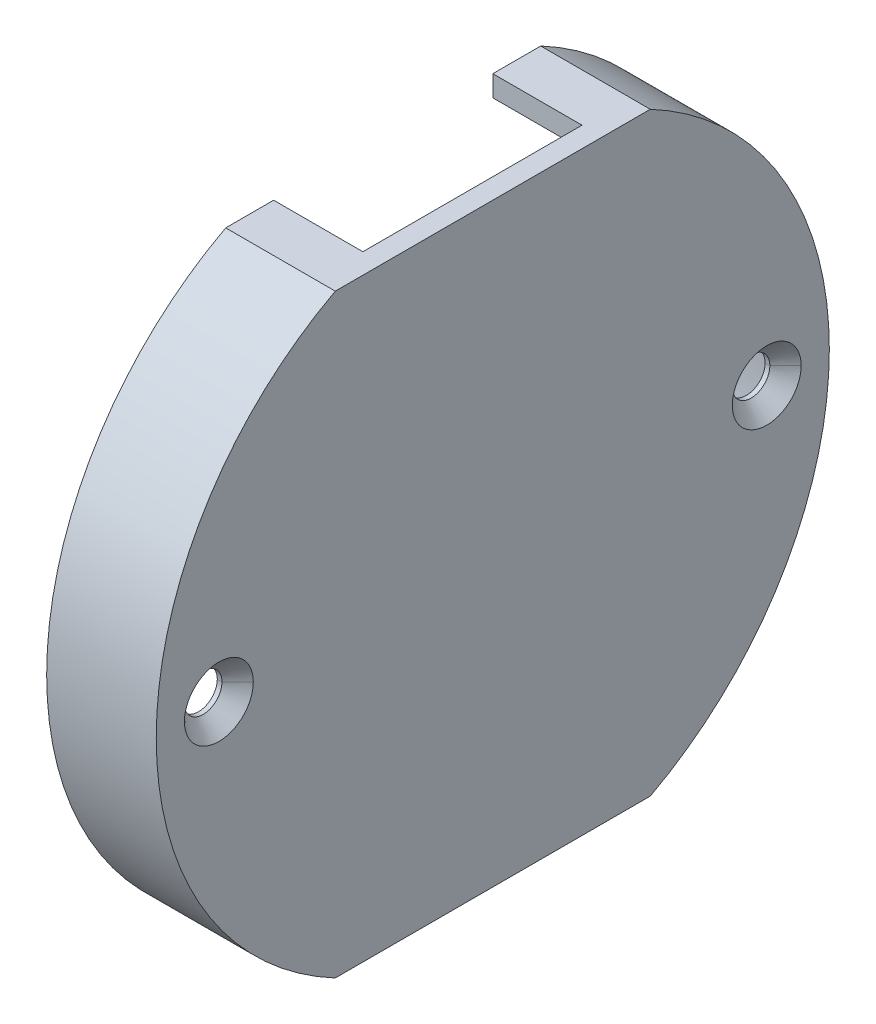
ISO-10303-21;
HEADER;
FILE_DESCRIPTION(('STEP AP214'),'2;1');
FILE_NAME('part.step','',(''),(''),'','','');
FILE_SCHEMA(('AUTOMOTIVE_DESIGN { 1 0 10303 214 1 1 1 1 }'));
ENDSEC;
DATA;
#1=APPLICATION_CONTEXT('core data for automotive mechanical design processes');
#2=APPLICATION_PROTOCOL_DEFINITION('international standard','automotive_design',2000,#1);
#3=PRODUCT_CONTEXT('',#1,'mechanical');
#4=PRODUCT('Part','Part','',(#3));
#5=PRODUCT_RELATED_PRODUCT_CATEGORY('part','',(#4));
#6=PRODUCT_DEFINITION_FORMATION('','',#4);
#7=PRODUCT_DEFINITION_CONTEXT('part definition',#1,'design');
#8=PRODUCT_DEFINITION('design','',#6,#7);
#9=PRODUCT_DEFINITION_SHAPE('','',#8);
#10=(LENGTH_UNIT() NAMED_UNIT(*) SI_UNIT(.MILLI.,.METRE.));
#11=(NAMED_UNIT(*) PLANE_ANGLE_UNIT() SI_UNIT($,.RADIAN.));
#12=(NAMED_UNIT(*) SI_UNIT($,.STERADIAN.) SOLID_ANGLE_UNIT());
#13=UNCERTAINTY_MEASURE_WITH_UNIT(LENGTH_MEASURE(1.E-05),#10,'distance_accuracy_value','');
#14=(GEOMETRIC_REPRESENTATION_CONTEXT(3) GLOBAL_UNCERTAINTY_ASSIGNED_CONTEXT((#13)) GLOBAL_UNIT_ASSIGNED_CONTEXT((#10,
#11,#12)) REPRESENTATION_CONTEXT('',''));
#15=CARTESIAN_POINT('',(0.,0.,0.));
#16=DIRECTION('',(0.,0.,1.));
#17=DIRECTION('',(1.,0.,0.));
#18=AXIS2_PLACEMENT_3D('',#15,#16,#17);
#19=CARTESIAN_POINT('',(-9.826057760967,14.645610965575,4.562544302552));
#20=DIRECTION('',(1.,0.,0.));
#21=DIRECTION('',(0.,-1.2508E-11,-1.));
#22=AXIS2_PLACEMENT_3D('',#19,#20,#21);
#23=CYLINDRICAL_SURFACE('',#22,21.5);
#24=DIRECTION('',(-1.,0.,0.));
#25=VECTOR('',#24,1.);
#26=CARTESIAN_POINT('',(-47.826057760967,-4.35438903455086,-5.49976159595941));
#27=LINE('',#26,#25);
#28=CARTESIAN_POINT('',(-1.826057760967,-4.35438903455086,-5.49976159595941));
#29=VERTEX_POINT('',#28);
#30=CARTESIAN_POINT('',(-8.826057760967,-4.35438903455086,-5.49976159595941));
#31=VERTEX_POINT('',#30);
#32=EDGE_CURVE('E318',#29,#31,#27,.T.);
#33=ORIENTED_EDGE('',*,*,#32,.T.);
#34=CARTESIAN_POINT('',(-8.826057760967,14.645610965575,4.562544302552));
#35=DIRECTION('',(-1.,0.,0.));
#36=DIRECTION('',(0.,0.,1.));
#37=AXIS2_PLACEMENT_3D('',#34,#35,#36);
#38=CIRCLE('',#37,21.5);
#39=CARTESIAN_POINT('',(-8.826057760967,14.6456109653061,-16.937455697448));
#40=VERTEX_POINT('',#39);
#41=EDGE_CURVE('E227',#40,#31,#38,.T.);
#42=ORIENTED_EDGE('',*,*,#41,.F.);
#43=DIRECTION('',(1.,0.,0.));
#44=VECTOR('',#43,1.);
#45=CARTESIAN_POINT('',(-9.826057760967,14.6456109653061,-16.937455697448));
#46=LINE('',#45,#44);
#47=CARTESIAN_POINT('',(-1.826057760967,14.6456109653061,-16.937455697448));
#48=VERTEX_POINT('',#47);
#49=EDGE_CURVE('E305',#40,#48,#46,.T.);
#50=ORIENTED_EDGE('',*,*,#49,.T.);
#51=CARTESIAN_POINT('',(-1.826057760967,14.645610965575,4.562544302552));
#52=DIRECTION('',(-1.,0.,0.));
#53=DIRECTION('',(0.,-1.2508E-11,-1.));
#54=AXIS2_PLACEMENT_3D('',#51,#52,#53);
#55=CIRCLE('',#54,21.5);
#56=EDGE_CURVE('E322',#48,#29,#55,.T.);
#57=ORIENTED_EDGE('',*,*,#56,.T.);
#58=EDGE_LOOP('',(#33,#42,#50,#57));
#59=FACE_BOUND('',#58,.T.);
#60=ADVANCED_FACE('F42',(#59),#23,.T.);
#61=CARTESIAN_POINT('',(-3.126057760967,14.645610965575,4.562544302552));
#62=DIRECTION('',(-1.,0.,0.));
#63=DIRECTION('',(0.,1.2508E-11,1.));
#64=AXIS2_PLACEMENT_3D('',#61,#62,#63);
#65=CYLINDRICAL_SURFACE('',#64,19.);
#66=CARTESIAN_POINT('',(-8.826057760967,14.645610965575,4.562544302552));
#67=DIRECTION('',(-1.,0.,0.));
#68=DIRECTION('',(0.,0.,1.));
#69=AXIS2_PLACEMENT_3D('',#66,#67,#68);
#70=CIRCLE('',#69,19.);
#71=CARTESIAN_POINT('',(-8.826057760967,32.3091326983183,11.5625443023311));
#72=VERTEX_POINT('',#71);
#73=CARTESIAN_POINT('',(-8.826057760967,14.645610965575,23.562544302552));
#74=VERTEX_POINT('',#73);
#75=EDGE_CURVE('E239',#72,#74,#70,.F.);
#76=ORIENTED_EDGE('',*,*,#75,.F.);
#77=DIRECTION('',(-1.,0.,0.));
#78=VECTOR('',#77,1.);
#79=CARTESIAN_POINT('',(-3.126057760967,32.3091326983183,11.5625443023311));
#80=LINE('',#79,#78);
#81=CARTESIAN_POINT('',(-3.126057760967,32.3091326983183,11.5625443023311));
#82=VERTEX_POINT('',#81);
#83=EDGE_CURVE('E279',#82,#72,#80,.T.);
#84=ORIENTED_EDGE('',*,*,#83,.F.);
#85=CARTESIAN_POINT('',(-3.126057760967,14.645610965575,4.562544302552));
#86=DIRECTION('',(-1.,0.,0.));
#87=DIRECTION('',(0.,1.2508E-11,1.));
#88=AXIS2_PLACEMENT_3D('',#85,#86,#87);
#89=CIRCLE('',#88,19.);
#90=CARTESIAN_POINT('',(-3.126057760967,14.6456109658127,23.562544302552));
#91=VERTEX_POINT('',#90);
#92=EDGE_CURVE('E286',#91,#82,#89,.T.);
#93=ORIENTED_EDGE('',*,*,#92,.F.);
#94=DIRECTION('',(-1.,0.,0.));
#95=VECTOR('',#94,1.);
#96=CARTESIAN_POINT('',(-3.126057760967,14.6456109658127,23.562544302552));
#97=LINE('',#96,#95);
#98=EDGE_CURVE('E299',#91,#74,#97,.T.);
#99=ORIENTED_EDGE('',*,*,#98,.T.);
#100=EDGE_LOOP('',(#76,#84,#93,#99));
#101=FACE_BOUND('',#100,.T.);
#102=ADVANCED_FACE('F474',(#101),#65,.F.);
#103=CARTESIAN_POINT('',(-47.826057760967,-4.35438903470274,-17.6427834972376));
#104=DIRECTION('',(0.,1.,-1.2508E-11));
#105=DIRECTION('',(0.,1.2508E-11,1.));
#106=AXIS2_PLACEMENT_3D('',#103,#104,#105);
#107=PLANE('',#106);
#108=DIRECTION('',(0.,1.2508E-11,1.));
#109=VECTOR('',#108,1.);
#110=CARTESIAN_POINT('',(-8.826057760967,-4.35438903470274,-17.6427834972376));
#111=LINE('',#110,#109);
#112=CARTESIAN_POINT('',(-8.826057760967,-4.35438903451255,-2.43745569721035));
#113=VERTEX_POINT('',#112);
#114=EDGE_CURVE('E442',#31,#113,#111,.T.);
#115=ORIENTED_EDGE('',*,*,#114,.F.);
#116=ORIENTED_EDGE('',*,*,#32,.F.);
#117=DIRECTION('',(0.,1.2508E-11,1.));
#118=VECTOR('',#117,1.);
#119=CARTESIAN_POINT('',(-1.826057760967,-4.354389034425,4.56254430278965));
#120=LINE('',#119,#118);
#121=CARTESIAN_POINT('',(-1.826057760967,-4.35438903429914,14.6248502015387));
#122=VERTEX_POINT('',#121);
#123=EDGE_CURVE('E285',#29,#122,#120,.T.);
#124=ORIENTED_EDGE('',*,*,#123,.T.);
#125=DIRECTION('',(1.,0.,0.));
#126=VECTOR('',#125,1.);
#127=CARTESIAN_POINT('',(-47.826057760967,-4.35438903429914,14.6248502015387));
#128=LINE('',#127,#126);
#129=CARTESIAN_POINT('',(-8.826057760967,-4.35438903429915,14.6248502015387));
#130=VERTEX_POINT('',#129);
#131=EDGE_CURVE('E253',#130,#122,#128,.T.);
#132=ORIENTED_EDGE('',*,*,#131,.F.);
#133=CARTESIAN_POINT('',(-8.826057760967,-4.35438903433744,11.5625443027897));
#134=VERTEX_POINT('',#133);
#135=EDGE_CURVE('E222',#134,#130,#111,.T.);
#136=ORIENTED_EDGE('',*,*,#135,.F.);
#137=DIRECTION('',(-1.,0.,0.));
#138=VECTOR('',#137,1.);
#139=CARTESIAN_POINT('',(-47.826057760967,-4.35438903433744,11.5625443027897));
#140=LINE('',#139,#138);
#141=CARTESIAN_POINT('',(-3.126057760967,-4.35438903433744,11.5625443027897));
#142=VERTEX_POINT('',#141);
#143=EDGE_CURVE('E293',#142,#134,#140,.T.);
#144=ORIENTED_EDGE('',*,*,#143,.F.);
#145=DIRECTION('',(0.,1.25079174365893E-11,1.));
#146=VECTOR('',#145,1.);
#147=CARTESIAN_POINT('',(-3.126057760967,-4.35438903470274,-17.6427834972376));
#148=LINE('',#147,#146);
#149=CARTESIAN_POINT('',(-3.126057760967,-4.35438903451255,-2.43745569721035));
#150=VERTEX_POINT('',#149);
#151=EDGE_CURVE('E311',#150,#142,#148,.T.);
#152=ORIENTED_EDGE('',*,*,#151,.F.);
#153=DIRECTION('',(1.,0.,0.));
#154=VECTOR('',#153,1.);
#155=CARTESIAN_POINT('',(-47.826057760967,-4.35438903451255,-2.43745569721035));
#156=LINE('',#155,#154);
#157=EDGE_CURVE('E347',#113,#150,#156,.T.);
#158=ORIENTED_EDGE('',*,*,#157,.F.);
#159=EDGE_LOOP('',(#115,#116,#124,#132,#136,#144,#152,#158));
#160=FACE_BOUND('',#159,.T.);
#161=ADVANCED_FACE('F506',(#160),#107,.F.);
#162=CARTESIAN_POINT('',(-9.826057760967,14.645610965575,4.562544302552));
#163=DIRECTION('',(1.,0.,0.));
#164=DIRECTION('',(0.,-1.2508E-11,-1.));
#165=AXIS2_PLACEMENT_3D('',#162,#163,#164);
#166=CYLINDRICAL_SURFACE('',#165,21.5);
#167=ORIENTED_EDGE('',*,*,#49,.F.);
#168=CARTESIAN_POINT('',(-8.826057760967,33.6456109654491,-5.49976159643472));
#169=VERTEX_POINT('',#168);
#170=EDGE_CURVE('E229',#169,#40,#38,.T.);
#171=ORIENTED_EDGE('',*,*,#170,.F.);
#172=DIRECTION('',(1.,0.,0.));
#173=VECTOR('',#172,1.);
#174=CARTESIAN_POINT('',(-9.826057760967,33.6456109654491,-5.49976159643469));
#175=LINE('',#174,#173);
#176=CARTESIAN_POINT('',(-1.826057760967,33.6456109654491,-5.49976159643469));
#177=VERTEX_POINT('',#176);
#178=EDGE_CURVE('E401',#169,#177,#175,.T.);
#179=ORIENTED_EDGE('',*,*,#178,.T.);
#180=CARTESIAN_POINT('',(-1.826057760967,14.645610965575,4.562544302552));
#181=DIRECTION('',(-1.,0.,0.));
#182=DIRECTION('',(0.,-1.25088881784197E-11,-1.));
#183=AXIS2_PLACEMENT_3D('',#180,#181,#182);
#184=CIRCLE('',#183,21.5);
#185=EDGE_CURVE('E378',#177,#48,#184,.T.);
#186=ORIENTED_EDGE('',*,*,#185,.T.);
#187=EDGE_LOOP('',(#167,#171,#179,#186));
#188=FACE_BOUND('',#187,.T.);
#189=ADVANCED_FACE('F538',(#188),#166,.T.);
#190=CARTESIAN_POINT('',(-47.826057760967,33.6456109657783,20.8193056053976));
#191=DIRECTION('',(0.,-1.,1.2508E-11));
#192=DIRECTION('',(1.,0.,0.));
#193=AXIS2_PLACEMENT_3D('',#190,#191,#192);
#194=PLANE('',#193);
#195=DIRECTION('',(0.,-1.2508E-11,-1.));
#196=VECTOR('',#195,1.);
#197=CARTESIAN_POINT('',(-8.826057760967,33.6456109657783,20.8193056053976));
#198=LINE('',#197,#196);
#199=CARTESIAN_POINT('',(-8.826057760967,33.6456109657009,14.6248502010634));
#200=VERTEX_POINT('',#199);
#201=CARTESIAN_POINT('',(-8.826057760967,33.6456109656626,11.5625443023143));
#202=VERTEX_POINT('',#201);
#203=EDGE_CURVE('E65',#200,#202,#198,.T.);
#204=ORIENTED_EDGE('',*,*,#203,.F.);
#205=DIRECTION('',(-1.,0.,0.));
#206=VECTOR('',#205,1.);
#207=CARTESIAN_POINT('',(-47.826057760967,33.6456109657009,14.6248502010634));
#208=LINE('',#207,#206);
#209=CARTESIAN_POINT('',(-1.826057760967,33.6456109657009,14.6248502010634));
#210=VERTEX_POINT('',#209);
#211=EDGE_CURVE('E235',#210,#200,#208,.T.);
#212=ORIENTED_EDGE('',*,*,#211,.F.);
#213=DIRECTION('',(0.,-1.2508E-11,-1.));
#214=VECTOR('',#213,1.);
#215=CARTESIAN_POINT('',(-1.826057760967,33.645610965575,4.56254430231435));
#216=LINE('',#215,#214);
#217=EDGE_CURVE('E264',#210,#177,#216,.T.);
#218=ORIENTED_EDGE('',*,*,#217,.T.);
#219=ORIENTED_EDGE('',*,*,#178,.F.);
#220=CARTESIAN_POINT('',(-8.826057760967,33.6456109654874,-2.43745569768565));
#221=VERTEX_POINT('',#220);
#222=EDGE_CURVE('E241',#221,#169,#198,.T.);
#223=ORIENTED_EDGE('',*,*,#222,.F.);
#224=DIRECTION('',(-1.,0.,0.));
#225=VECTOR('',#224,1.);
#226=CARTESIAN_POINT('',(-47.826057760967,33.6456109654874,-2.43745569768565));
#227=LINE('',#226,#225);
#228=CARTESIAN_POINT('',(-3.126057760967,33.6456109654874,-2.43745569768565));
#229=VERTEX_POINT('',#228);
#230=EDGE_CURVE('E274',#229,#221,#227,.T.);
#231=ORIENTED_EDGE('',*,*,#230,.F.);
#232=DIRECTION('',(0.,-1.2508E-11,-1.));
#233=VECTOR('',#232,1.);
#234=CARTESIAN_POINT('',(-3.126057760967,33.6456109657783,20.8193056053976));
#235=LINE('',#234,#233);
#236=CARTESIAN_POINT('',(-3.126057760967,33.6456109656626,11.5625443023143));
#237=VERTEX_POINT('',#236);
#238=EDGE_CURVE('E316',#237,#229,#235,.T.);
#239=ORIENTED_EDGE('',*,*,#238,.F.);
#240=DIRECTION('',(1.,0.,0.));
#241=VECTOR('',#240,1.);
#242=CARTESIAN_POINT('',(-47.826057760967,33.6456109656626,11.5625443023143));
#243=LINE('',#242,#241);
#244=EDGE_CURVE('E237',#202,#237,#243,.T.);
#245=ORIENTED_EDGE('',*,*,#244,.F.);
#246=EDGE_LOOP('',(#204,#212,#218,#219,#223,#231,#239,#245));
#247=FACE_BOUND('',#246,.T.);
#248=ADVANCED_FACE('F233',(#247),#194,.F.);
#249=CARTESIAN_POINT('',(-9.826057760967,14.645610965575,4.562544302552));
#250=DIRECTION('',(1.,0.,0.));
#251=DIRECTION('',(0.,-1.2508E-11,-1.));
#252=AXIS2_PLACEMENT_3D('',#249,#250,#251);
#253=CYLINDRICAL_SURFACE('',#252,21.5);
#254=ORIENTED_EDGE('',*,*,#211,.T.);
#255=EDGE_CURVE('E219',#130,#200,#38,.T.);
#256=ORIENTED_EDGE('',*,*,#255,.F.);
#257=ORIENTED_EDGE('',*,*,#131,.T.);
#258=CARTESIAN_POINT('',(-1.826057760967,14.645610965575,4.562544302552));
#259=DIRECTION('',(-1.,0.,0.));
#260=DIRECTION('',(0.,-1.2508E-11,-1.));
#261=AXIS2_PLACEMENT_3D('',#258,#259,#260);
#262=CIRCLE('',#261,21.5);
#263=EDGE_CURVE('E244',#122,#210,#262,.T.);
#264=ORIENTED_EDGE('',*,*,#263,.T.);
#265=EDGE_LOOP('',(#254,#256,#257,#264));
#266=FACE_BOUND('',#265,.T.);
#267=ADVANCED_FACE('F242',(#266),#253,.T.);
#268=CARTESIAN_POINT('',(-3.126057760967,14.645610965575,4.562544302552));
#269=DIRECTION('',(-1.,0.,0.));
#270=DIRECTION('',(0.,1.2508E-11,1.));
#271=AXIS2_PLACEMENT_3D('',#268,#269,#270);
#272=CYLINDRICAL_SURFACE('',#271,19.);
#273=CARTESIAN_POINT('',(-8.826057760967,14.645610965575,4.562544302552));
#274=DIRECTION('',(-1.,0.,0.));
#275=DIRECTION('',(0.,0.,1.));
#276=AXIS2_PLACEMENT_3D('',#273,#274,#275);
#277=CIRCLE('',#276,19.);
#278=CARTESIAN_POINT('',(-8.826057760967,-3.01791076716825,-2.43745569722706));
#279=VERTEX_POINT('',#278);
#280=CARTESIAN_POINT('',(-8.826057760967,32.3091326981431,-2.43745569766894));
#281=VERTEX_POINT('',#280);
#282=EDGE_CURVE('E58',#279,#281,#277,.F.);
#283=ORIENTED_EDGE('',*,*,#282,.F.);
#284=DIRECTION('',(-1.,0.,0.));
#285=VECTOR('',#284,1.);
#286=CARTESIAN_POINT('',(-3.126057760967,-3.01791076716825,-2.43745569722706));
#287=LINE('',#286,#285);
#288=CARTESIAN_POINT('',(-3.126057760967,-3.01791076716825,-2.43745569722706));
#289=VERTEX_POINT('',#288);
#290=EDGE_CURVE('E344',#289,#279,#287,.T.);
#291=ORIENTED_EDGE('',*,*,#290,.F.);
#292=CARTESIAN_POINT('',(-3.126057760967,14.645610965575,4.562544302552));
#293=DIRECTION('',(-1.,0.,0.));
#294=DIRECTION('',(0.,1.2508E-11,1.));
#295=AXIS2_PLACEMENT_3D('',#292,#293,#294);
#296=CIRCLE('',#295,19.);
#297=CARTESIAN_POINT('',(-3.126057760967,32.3091326981431,-2.43745569766894));
#298=VERTEX_POINT('',#297);
#299=EDGE_CURVE('E317',#298,#289,#296,.T.);
#300=ORIENTED_EDGE('',*,*,#299,.F.);
#301=DIRECTION('',(1.,0.,0.));
#302=VECTOR('',#301,1.);
#303=CARTESIAN_POINT('',(-3.126057760967,32.3091326981431,-2.43745569766894));
#304=LINE('',#303,#302);
#305=EDGE_CURVE('E278',#281,#298,#304,.T.);
#306=ORIENTED_EDGE('',*,*,#305,.F.);
#307=EDGE_LOOP('',(#283,#291,#300,#306));
#308=FACE_BOUND('',#307,.T.);
#309=ADVANCED_FACE('F44',(#308),#272,.F.);
#310=CARTESIAN_POINT('',(-3.126057760967,14.645610965575,4.562544302552));
#311=DIRECTION('',(-1.,0.,0.));
#312=DIRECTION('',(0.,1.2508E-11,1.));
#313=AXIS2_PLACEMENT_3D('',#310,#311,#312);
#314=CYLINDRICAL_SURFACE('',#313,19.);
#315=CARTESIAN_POINT('',(-8.826057760967,14.645610965575,4.562544302552));
#316=DIRECTION('',(-1.,0.,0.));
#317=DIRECTION('',(0.,0.,1.));
#318=AXIS2_PLACEMENT_3D('',#315,#316,#317);
#319=CIRCLE('',#318,19.);
#320=CARTESIAN_POINT('',(-8.826057760967,-3.01791076699314,11.5625443027729));
#321=VERTEX_POINT('',#320);
#322=EDGE_CURVE('E458',#74,#321,#319,.F.);
#323=ORIENTED_EDGE('',*,*,#322,.F.);
#324=ORIENTED_EDGE('',*,*,#98,.F.);
#325=CARTESIAN_POINT('',(-3.126057760967,14.645610965575,4.562544302552));
#326=DIRECTION('',(-1.,0.,0.));
#327=DIRECTION('',(0.,1.2508E-11,1.));
#328=AXIS2_PLACEMENT_3D('',#325,#326,#327);
#329=CIRCLE('',#328,19.);
#330=CARTESIAN_POINT('',(-3.126057760967,-3.01791076699314,11.5625443027729));
#331=VERTEX_POINT('',#330);
#332=EDGE_CURVE('E289',#331,#91,#329,.T.);
#333=ORIENTED_EDGE('',*,*,#332,.F.);
#334=DIRECTION('',(1.,0.,0.));
#335=VECTOR('',#334,1.);
#336=CARTESIAN_POINT('',(-3.126057760967,-3.01791076699314,11.5625443027729));
#337=LINE('',#336,#335);
#338=EDGE_CURVE('E291',#321,#331,#337,.T.);
#339=ORIENTED_EDGE('',*,*,#338,.F.);
#340=EDGE_LOOP('',(#323,#324,#333,#339));
#341=FACE_BOUND('',#340,.T.);
#342=ADVANCED_FACE('F471',(#341),#314,.F.);
#343=CARTESIAN_POINT('',(-3.126057760967,-19.8043890343374,11.5625443029829));
#344=DIRECTION('',(0.,1.2508E-11,1.));
#345=DIRECTION('',(0.,1.,-1.2508E-11));
#346=AXIS2_PLACEMENT_3D('',#343,#344,#345);
#347=PLANE('',#346);
#348=DIRECTION('',(0.,-1.,1.2508E-11));
#349=VECTOR('',#348,1.);
#350=CARTESIAN_POINT('',(-8.826057760967,-19.8043890343374,11.5625443029829));
#351=LINE('',#350,#349);
#352=EDGE_CURVE('E455',#321,#134,#351,.T.);
#353=ORIENTED_EDGE('',*,*,#352,.F.);
#354=ORIENTED_EDGE('',*,*,#338,.T.);
#355=DIRECTION('',(0.,1.,-1.2508E-11));
#356=VECTOR('',#355,1.);
#357=CARTESIAN_POINT('',(-3.126057760967,14.6456109656626,11.562544302552));
#358=LINE('',#357,#356);
#359=EDGE_CURVE('E343',#142,#331,#358,.T.);
#360=ORIENTED_EDGE('',*,*,#359,.F.);
#361=ORIENTED_EDGE('',*,*,#143,.T.);
#362=EDGE_LOOP('',(#353,#354,#360,#361));
#363=FACE_BOUND('',#362,.T.);
#364=ADVANCED_FACE('F489',(#363),#347,.F.);
#365=CARTESIAN_POINT('',(-3.126057760967,-19.8043890345126,-2.4374556970171));
#366=DIRECTION('',(0.,-1.2508E-11,-1.));
#367=DIRECTION('',(0.,1.,-1.2508E-11));
#368=AXIS2_PLACEMENT_3D('',#365,#366,#367);
#369=PLANE('',#368);
#370=DIRECTION('',(0.,1.,-1.2508E-11));
#371=VECTOR('',#370,1.);
#372=CARTESIAN_POINT('',(-8.826057760967,-19.8043890345126,-2.4374556970171));
#373=LINE('',#372,#371);
#374=EDGE_CURVE('E447',#113,#279,#373,.T.);
#375=ORIENTED_EDGE('',*,*,#374,.F.);
#376=ORIENTED_EDGE('',*,*,#157,.T.);
#377=DIRECTION('',(0.,-1.,1.2508E-11));
#378=VECTOR('',#377,1.);
#379=CARTESIAN_POINT('',(-3.126057760967,14.6456109654874,-2.437455697448));
#380=LINE('',#379,#378);
#381=EDGE_CURVE('E306',#289,#150,#380,.T.);
#382=ORIENTED_EDGE('',*,*,#381,.F.);
#383=ORIENTED_EDGE('',*,*,#290,.T.);
#384=EDGE_LOOP('',(#375,#376,#382,#383));
#385=FACE_BOUND('',#384,.T.);
#386=ADVANCED_FACE('F487',(#385),#369,.F.);
#387=CARTESIAN_POINT('',(-3.126057760967,-19.8043890345126,-2.4374556970171));
#388=DIRECTION('',(0.,-1.2508E-11,-1.));
#389=DIRECTION('',(0.,1.,-1.2508E-11));
#390=AXIS2_PLACEMENT_3D('',#387,#388,#389);
#391=PLANE('',#390);
#392=DIRECTION('',(0.,1.,-1.2508E-11));
#393=VECTOR('',#392,1.);
#394=CARTESIAN_POINT('',(-8.826057760967,-19.8043890345126,-2.4374556970171));
#395=LINE('',#394,#393);
#396=EDGE_CURVE('E454',#281,#221,#395,.T.);
#397=ORIENTED_EDGE('',*,*,#396,.F.);
#398=ORIENTED_EDGE('',*,*,#305,.T.);
#399=DIRECTION('',(0.,-1.,1.2508E-11));
#400=VECTOR('',#399,1.);
#401=CARTESIAN_POINT('',(-3.126057760967,14.6456109654874,-2.437455697448));
#402=LINE('',#401,#400);
#403=EDGE_CURVE('E312',#229,#298,#402,.T.);
#404=ORIENTED_EDGE('',*,*,#403,.F.);
#405=ORIENTED_EDGE('',*,*,#230,.T.);
#406=EDGE_LOOP('',(#397,#398,#404,#405));
#407=FACE_BOUND('',#406,.T.);
#408=ADVANCED_FACE('F483',(#407),#391,.F.);
#409=CARTESIAN_POINT('',(-3.126057760967,-19.8043890343374,11.5625443029829));
#410=DIRECTION('',(0.,1.2508E-11,1.));
#411=DIRECTION('',(0.,1.,-1.2508E-11));
#412=AXIS2_PLACEMENT_3D('',#409,#410,#411);
#413=PLANE('',#412);
#414=DIRECTION('',(0.,-1.,1.2508E-11));
#415=VECTOR('',#414,1.);
#416=CARTESIAN_POINT('',(-8.826057760967,-19.8043890343374,11.5625443029829));
#417=LINE('',#416,#415);
#418=EDGE_CURVE('E11',#202,#72,#417,.T.);
#419=ORIENTED_EDGE('',*,*,#418,.F.);
#420=ORIENTED_EDGE('',*,*,#244,.T.);
#421=DIRECTION('',(0.,1.,-1.2508E-11));
#422=VECTOR('',#421,1.);
#423=CARTESIAN_POINT('',(-3.126057760967,14.6456109656626,11.562544302552));
#424=LINE('',#423,#422);
#425=EDGE_CURVE('E290',#82,#237,#424,.T.);
#426=ORIENTED_EDGE('',*,*,#425,.F.);
#427=ORIENTED_EDGE('',*,*,#83,.T.);
#428=EDGE_LOOP('',(#419,#420,#426,#427));
#429=FACE_BOUND('',#428,.T.);
#430=ADVANCED_FACE('F479',(#429),#413,.F.);
#431=CARTESIAN_POINT('',(-3.126057760967,14.645610965575,4.562544302552));
#432=DIRECTION('',(-1.,0.,0.));
#433=DIRECTION('',(0.,1.2508E-11,1.));
#434=AXIS2_PLACEMENT_3D('',#431,#432,#433);
#435=PLANE('',#434);
#436=CARTESIAN_POINT('',(-3.126057760967,14.6456109657939,22.062544302552));
#437=DIRECTION('',(1.,0.,0.));
#438=DIRECTION('',(0.,-1.2508E-11,-1.));
#439=AXIS2_PLACEMENT_3D('',#436,#437,#438);
#440=CIRCLE('',#439,1.2);
#441=CARTESIAN_POINT('',(-3.126057760967,14.6456109657789,20.862544302552));
#442=VERTEX_POINT('',#441);
#443=CARTESIAN_POINT('',(-3.126057760967,14.6456109658089,23.262544302552));
#444=VERTEX_POINT('',#443);
#445=EDGE_CURVE('E329',#442,#444,#440,.T.);
#446=ORIENTED_EDGE('',*,*,#445,.T.);
#447=CARTESIAN_POINT('',(-3.126057760967,14.6456109657939,22.062544302552));
#448=DIRECTION('',(1.,0.,0.));
#449=DIRECTION('',(0.,-1.2508E-11,-1.));
#450=AXIS2_PLACEMENT_3D('',#447,#448,#449);
#451=CIRCLE('',#450,1.2);
#452=EDGE_CURVE('E333',#444,#442,#451,.T.);
#453=ORIENTED_EDGE('',*,*,#452,.T.);
#454=EDGE_LOOP('',(#446,#453));
#455=FACE_BOUND('',#454,.T.);
#456=CARTESIAN_POINT('',(-3.126057760967,14.6456109653561,-12.937455697448));
#457=DIRECTION('',(1.,0.,0.));
#458=DIRECTION('',(0.,-1.2508E-11,-1.));
#459=AXIS2_PLACEMENT_3D('',#456,#457,#458);
#460=CIRCLE('',#459,1.2);
#461=CARTESIAN_POINT('',(-3.126057760967,14.6456109653411,-14.137455697448));
#462=VERTEX_POINT('',#461);
#463=CARTESIAN_POINT('',(-3.126057760967,14.6456109653711,-11.737455697448));
#464=VERTEX_POINT('',#463);
#465=EDGE_CURVE('E384',#462,#464,#460,.T.);
#466=ORIENTED_EDGE('',*,*,#465,.T.);
#467=CARTESIAN_POINT('',(-3.126057760967,14.6456109653561,-12.937455697448));
#468=DIRECTION('',(1.,0.,0.));
#469=DIRECTION('',(0.,-1.2508E-11,-1.));
#470=AXIS2_PLACEMENT_3D('',#467,#468,#469);
#471=CIRCLE('',#470,1.2);
#472=EDGE_CURVE('E268',#464,#462,#471,.T.);
#473=ORIENTED_EDGE('',*,*,#472,.T.);
#474=EDGE_LOOP('',(#466,#473));
#475=FACE_BOUND('',#474,.T.);
#476=CARTESIAN_POINT('',(-3.126057760967,14.645610965575,4.562544302552));
#477=DIRECTION('',(1.,0.,0.));
#478=DIRECTION('',(0.,1.2508E-11,1.));
#479=AXIS2_PLACEMENT_3D('',#476,#477,#478);
#480=CIRCLE('',#479,16.);
#481=CARTESIAN_POINT('',(-3.126057760967,14.6456109657751,20.562544302552));
#482=VERTEX_POINT('',#481);
#483=CARTESIAN_POINT('',(-3.126057760967,14.6456109653749,-11.437455697448));
#484=VERTEX_POINT('',#483);
#485=EDGE_CURVE('E265',#482,#484,#480,.T.);
#486=ORIENTED_EDGE('',*,*,#485,.T.);
#487=CARTESIAN_POINT('',(-3.126057760967,14.645610965575,4.562544302552));
#488=DIRECTION('',(1.,0.,0.));
#489=DIRECTION('',(0.,1.2508E-11,1.));
#490=AXIS2_PLACEMENT_3D('',#487,#488,#489);
#491=CIRCLE('',#490,16.);
#492=EDGE_CURVE('E269',#484,#482,#491,.T.);
#493=ORIENTED_EDGE('',*,*,#492,.T.);
#494=EDGE_LOOP('',(#486,#493));
#495=FACE_BOUND('',#494,.T.);
#496=ORIENTED_EDGE('',*,*,#299,.T.);
#497=ORIENTED_EDGE('',*,*,#381,.T.);
#498=ORIENTED_EDGE('',*,*,#151,.T.);
#499=ORIENTED_EDGE('',*,*,#359,.T.);
#500=ORIENTED_EDGE('',*,*,#332,.T.);
#501=ORIENTED_EDGE('',*,*,#92,.T.);
#502=ORIENTED_EDGE('',*,*,#425,.T.);
#503=ORIENTED_EDGE('',*,*,#238,.T.);
#504=ORIENTED_EDGE('',*,*,#403,.T.);
#505=EDGE_LOOP('',(#496,#497,#498,#499,#500,#501,#502,#503,#504));
#506=FACE_BOUND('',#505,.T.);
#507=ADVANCED_FACE('F477',(#455,#475,#495,#506),#435,.T.);
#508=CARTESIAN_POINT('',(-1.826057760967,14.6456109653561,-12.937455697448));
#509=DIRECTION('',(1.,0.,0.));
#510=DIRECTION('',(0.,-1.2508E-11,-1.));
#511=AXIS2_PLACEMENT_3D('',#508,#509,#510);
#512=CONICAL_SURFACE('',#511,2.20000000000027,0.785398163425871);
#513=CARTESIAN_POINT('',(-2.82605776094335,14.6456109653561,-12.937455697448));
#514=DIRECTION('',(1.,0.,0.));
#515=DIRECTION('',(0.,-1.2508E-11,-1.));
#516=AXIS2_PLACEMENT_3D('',#513,#514,#515);
#517=CIRCLE('',#516,1.19999999996707);
#518=CARTESIAN_POINT('',(-2.82605776094335,14.6456109653711,-11.7374556974809));
#519=VERTEX_POINT('',#518);
#520=CARTESIAN_POINT('',(-2.82605776094335,14.6456109653411,-14.1374556974151));
#521=VERTEX_POINT('',#520);
#522=EDGE_CURVE('E260',#519,#521,#517,.T.);
#523=ORIENTED_EDGE('',*,*,#522,.F.);
#524=DIRECTION('',(0.70710678116645,8.84457821493834E-12,0.707106781206645));
#525=VECTOR('',#524,1.);
#526=CARTESIAN_POINT('',(-1.826057760967,14.6456109653836,-10.7374556974477));
#527=LINE('',#526,#525);
#528=CARTESIAN_POINT('',(-1.82605776095108,14.6456109653836,-10.7374556974318));
#529=VERTEX_POINT('',#528);
#530=EDGE_CURVE('E51',#519,#529,#527,.T.);
#531=ORIENTED_EDGE('',*,*,#530,.T.);
#532=CARTESIAN_POINT('',(-1.82605776095108,14.6456109653561,-12.937455697448));
#533=DIRECTION('',(1.,0.,0.));
#534=DIRECTION('',(0.,-1.2508E-11,-1.));
#535=AXIS2_PLACEMENT_3D('',#532,#533,#534);
#536=CIRCLE('',#535,2.20000000001619);
#537=CARTESIAN_POINT('',(-1.82605776095108,14.6456109653286,-15.1374556974642));
#538=VERTEX_POINT('',#537);
#539=EDGE_CURVE('E273',#529,#538,#536,.T.);
#540=ORIENTED_EDGE('',*,*,#539,.T.);
#541=DIRECTION('',(0.70710678116645,-8.84449161933272E-12,-0.707106781206645));
#542=VECTOR('',#541,1.);
#543=CARTESIAN_POINT('',(-1.826057760967,14.6456109653286,-15.1374556974483));
#544=LINE('',#543,#542);
#545=EDGE_CURVE('E372',#521,#538,#544,.T.);
#546=ORIENTED_EDGE('',*,*,#545,.F.);
#547=EDGE_LOOP('',(#523,#531,#540,#546));
#548=FACE_BOUND('',#547,.T.);
#549=ADVANCED_FACE('F514',(#548),#512,.F.);
#550=CARTESIAN_POINT('',(-1.82605776085331,14.6456109657939,22.062544302552));
#551=DIRECTION('',(1.,0.,0.));
#552=DIRECTION('',(0.,-1.2508E-11,-1.));
#553=AXIS2_PLACEMENT_3D('',#550,#551,#552);
#554=CONICAL_SURFACE('',#553,2.19999999997527,0.785398163369026);
#555=CARTESIAN_POINT('',(-2.82605776088651,14.6456109657939,22.062544302552));
#556=DIRECTION('',(1.,0.,0.));
#557=DIRECTION('',(0.,-1.2508E-11,-1.));
#558=AXIS2_PLACEMENT_3D('',#555,#556,#557);
#559=CIRCLE('',#558,1.19999999999891);
#560=CARTESIAN_POINT('',(-2.82605776088651,14.6456109658089,23.2625443025509));
#561=VERTEX_POINT('',#560);
#562=CARTESIAN_POINT('',(-2.82605776088651,14.6456109657789,20.8625443025531));
#563=VERTEX_POINT('',#562);
#564=EDGE_CURVE('E294',#561,#563,#559,.T.);
#565=ORIENTED_EDGE('',*,*,#564,.F.);
#566=DIRECTION('',(0.707106781206645,8.84457821443558E-12,0.70710678116645));
#567=VECTOR('',#566,1.);
#568=CARTESIAN_POINT('',(-1.82605776085331,14.6456109658214,24.2625443025272));
#569=LINE('',#568,#567);
#570=CARTESIAN_POINT('',(-1.82605776091016,14.6456109658214,24.2625443024705));
#571=VERTEX_POINT('',#570);
#572=EDGE_CURVE('E304',#561,#571,#569,.T.);
#573=ORIENTED_EDGE('',*,*,#572,.T.);
#574=CARTESIAN_POINT('',(-1.82605776091016,14.6456109657939,22.062544302552));
#575=DIRECTION('',(1.,0.,0.));
#576=DIRECTION('',(0.,-1.2508E-11,-1.));
#577=AXIS2_PLACEMENT_3D('',#574,#575,#576);
#578=CIRCLE('',#577,2.19999999991842);
#579=CARTESIAN_POINT('',(-1.82605776091016,14.6456109657664,19.8625443026336));
#580=VERTEX_POINT('',#579);
#581=EDGE_CURVE('E300',#571,#580,#578,.T.);
#582=ORIENTED_EDGE('',*,*,#581,.T.);
#583=DIRECTION('',(0.707106781206645,-8.84449161882996E-12,-0.70710678116645));
#584=VECTOR('',#583,1.);
#585=CARTESIAN_POINT('',(-1.82605776085331,14.6456109657664,19.8625443025767));
#586=LINE('',#585,#584);
#587=EDGE_CURVE('E284',#563,#580,#586,.T.);
#588=ORIENTED_EDGE('',*,*,#587,.F.);
#589=EDGE_LOOP('',(#565,#573,#582,#588));
#590=FACE_BOUND('',#589,.T.);
#591=ADVANCED_FACE('F520',(#590),#554,.F.);
#592=CARTESIAN_POINT('',(-24.226057760967,14.6456109653561,-12.937455697448));
#593=DIRECTION('',(1.,0.,0.));
#594=DIRECTION('',(0.,-1.2508E-11,-1.));
#595=AXIS2_PLACEMENT_3D('',#592,#593,#594);
#596=CYLINDRICAL_SURFACE('',#595,1.2);
#597=ORIENTED_EDGE('',*,*,#472,.F.);
#598=DIRECTION('',(1.,0.,0.));
#599=VECTOR('',#598,1.);
#600=CARTESIAN_POINT('',(-24.226057760967,14.6456109653711,-11.737455697448));
#601=LINE('',#600,#599);
#602=EDGE_CURVE('E323',#464,#519,#601,.T.);
#603=ORIENTED_EDGE('',*,*,#602,.T.);
#604=ORIENTED_EDGE('',*,*,#522,.T.);
#605=DIRECTION('',(1.,0.,0.));
#606=VECTOR('',#605,1.);
#607=CARTESIAN_POINT('',(-24.226057760967,14.6456109653411,-14.137455697448));
#608=LINE('',#607,#606);
#609=EDGE_CURVE('E247',#462,#521,#608,.T.);
#610=ORIENTED_EDGE('',*,*,#609,.F.);
#611=EDGE_LOOP('',(#597,#603,#604,#610));
#612=FACE_BOUND('',#611,.T.);
#613=ADVANCED_FACE('F549',(#612),#596,.F.);
#614=CARTESIAN_POINT('',(-24.226057760967,14.6456109657939,22.062544302552));
#615=DIRECTION('',(1.,0.,0.));
#616=DIRECTION('',(0.,-1.2508E-11,-1.));
#617=AXIS2_PLACEMENT_3D('',#614,#615,#616);
#618=CYLINDRICAL_SURFACE('',#617,1.2);
#619=ORIENTED_EDGE('',*,*,#452,.F.);
#620=DIRECTION('',(1.,0.,0.));
#621=VECTOR('',#620,1.);
#622=CARTESIAN_POINT('',(-24.226057760967,14.6456109658089,23.262544302552));
#623=LINE('',#622,#621);
#624=EDGE_CURVE('E298',#444,#561,#623,.T.);
#625=ORIENTED_EDGE('',*,*,#624,.T.);
#626=ORIENTED_EDGE('',*,*,#564,.T.);
#627=DIRECTION('',(1.,0.,0.));
#628=VECTOR('',#627,1.);
#629=CARTESIAN_POINT('',(-24.226057760967,14.6456109657789,20.862544302552));
#630=LINE('',#629,#628);
#631=EDGE_CURVE('E340',#442,#563,#630,.T.);
#632=ORIENTED_EDGE('',*,*,#631,.F.);
#633=EDGE_LOOP('',(#619,#625,#626,#632));
#634=FACE_BOUND('',#633,.T.);
#635=ADVANCED_FACE('F544',(#634),#618,.F.);
#636=CARTESIAN_POINT('',(-2.826057760967,14.645610965575,4.562544302552));
#637=DIRECTION('',(-1.,0.,0.));
#638=DIRECTION('',(0.,1.2508E-11,1.));
#639=AXIS2_PLACEMENT_3D('',#636,#637,#638);
#640=CYLINDRICAL_SURFACE('',#639,16.);
#641=CARTESIAN_POINT('',(-2.826057760967,14.645610965575,4.562544302552));
#642=DIRECTION('',(-1.,0.,0.));
#643=DIRECTION('',(0.,1.2508E-11,1.));
#644=AXIS2_PLACEMENT_3D('',#641,#642,#643);
#645=CIRCLE('',#644,16.);
#646=CARTESIAN_POINT('',(-2.826057760967,14.6456109653749,-11.437455697448));
#647=VERTEX_POINT('',#646);
#648=CARTESIAN_POINT('',(-2.826057760967,14.6456109657751,20.562544302552));
#649=VERTEX_POINT('',#648);
#650=EDGE_CURVE('E416',#647,#649,#645,.T.);
#651=ORIENTED_EDGE('',*,*,#650,.F.);
#652=DIRECTION('',(-1.,0.,0.));
#653=VECTOR('',#652,1.);
#654=CARTESIAN_POINT('',(-2.826057760967,14.6456109653749,-11.437455697448));
#655=LINE('',#654,#653);
#656=EDGE_CURVE('E368',#647,#484,#655,.T.);
#657=ORIENTED_EDGE('',*,*,#656,.T.);
#658=ORIENTED_EDGE('',*,*,#485,.F.);
#659=DIRECTION('',(-1.,0.,0.));
#660=VECTOR('',#659,1.);
#661=CARTESIAN_POINT('',(-2.826057760967,14.6456109657751,20.562544302552));
#662=LINE('',#661,#660);
#663=EDGE_CURVE('E336',#649,#482,#662,.T.);
#664=ORIENTED_EDGE('',*,*,#663,.F.);
#665=EDGE_LOOP('',(#651,#657,#658,#664));
#666=FACE_BOUND('',#665,.T.);
#667=ADVANCED_FACE('F541',(#666),#640,.F.);
#668=CARTESIAN_POINT('',(-1.826057760967,14.645610965575,4.562544302552));
#669=DIRECTION('',(-1.,0.,0.));
#670=DIRECTION('',(0.,1.2508E-11,1.));
#671=AXIS2_PLACEMENT_3D('',#668,#669,#670);
#672=PLANE('',#671);
#673=ORIENTED_EDGE('',*,*,#123,.F.);
#674=ORIENTED_EDGE('',*,*,#56,.F.);
#675=ORIENTED_EDGE('',*,*,#185,.F.);
#676=ORIENTED_EDGE('',*,*,#217,.F.);
#677=ORIENTED_EDGE('',*,*,#263,.F.);
#678=EDGE_LOOP('',(#673,#674,#675,#676,#677));
#679=FACE_BOUND('',#678,.T.);
#680=CARTESIAN_POINT('',(-1.82605776095108,14.6456109653561,-12.937455697448));
#681=DIRECTION('',(1.,0.,0.));
#682=DIRECTION('',(0.,-1.2508E-11,-1.));
#683=AXIS2_PLACEMENT_3D('',#680,#681,#682);
#684=CIRCLE('',#683,2.20000000001619);
#685=EDGE_CURVE('E326',#538,#529,#684,.T.);
#686=ORIENTED_EDGE('',*,*,#685,.F.);
#687=ORIENTED_EDGE('',*,*,#539,.F.);
#688=EDGE_LOOP('',(#686,#687));
#689=FACE_BOUND('',#688,.T.);
#690=CARTESIAN_POINT('',(-1.82605776091016,14.6456109657939,22.062544302552));
#691=DIRECTION('',(1.,0.,0.));
#692=DIRECTION('',(0.,-1.2508E-11,-1.));
#693=AXIS2_PLACEMENT_3D('',#690,#691,#692);
#694=CIRCLE('',#693,2.19999999991842);
#695=EDGE_CURVE('E280',#580,#571,#694,.T.);
#696=ORIENTED_EDGE('',*,*,#695,.F.);
#697=ORIENTED_EDGE('',*,*,#581,.F.);
#698=EDGE_LOOP('',(#696,#697));
#699=FACE_BOUND('',#698,.T.);
#700=ADVANCED_FACE('F543',(#679,#689,#699),#672,.F.);
#701=CARTESIAN_POINT('',(-1.826057760967,14.6456109653561,-12.937455697448));
#702=DIRECTION('',(1.,0.,0.));
#703=DIRECTION('',(0.,-1.2508E-11,-1.));
#704=AXIS2_PLACEMENT_3D('',#701,#702,#703);
#705=CONICAL_SURFACE('',#704,2.20000000000027,0.785398163425871);
#706=ORIENTED_EDGE('',*,*,#530,.F.);
#707=CARTESIAN_POINT('',(-2.82605776094335,14.6456109653561,-12.937455697448));
#708=DIRECTION('',(1.,0.,0.));
#709=DIRECTION('',(0.,-1.2508E-11,-1.));
#710=AXIS2_PLACEMENT_3D('',#707,#708,#709);
#711=CIRCLE('',#710,1.19999999996707);
#712=EDGE_CURVE('E256',#521,#519,#711,.T.);
#713=ORIENTED_EDGE('',*,*,#712,.F.);
#714=ORIENTED_EDGE('',*,*,#545,.T.);
#715=ORIENTED_EDGE('',*,*,#685,.T.);
#716=EDGE_LOOP('',(#706,#713,#714,#715));
#717=FACE_BOUND('',#716,.T.);
#718=ADVANCED_FACE('F526',(#717),#705,.F.);
#719=CARTESIAN_POINT('',(-1.82605776085331,14.6456109657939,22.062544302552));
#720=DIRECTION('',(1.,0.,0.));
#721=DIRECTION('',(0.,-1.2508E-11,-1.));
#722=AXIS2_PLACEMENT_3D('',#719,#720,#721);
#723=CONICAL_SURFACE('',#722,2.19999999997527,0.785398163369026);
#724=ORIENTED_EDGE('',*,*,#572,.F.);
#725=CARTESIAN_POINT('',(-2.82605776088651,14.6456109657939,22.062544302552));
#726=DIRECTION('',(1.,0.,0.));
#727=DIRECTION('',(0.,-1.2508E-11,-1.));
#728=AXIS2_PLACEMENT_3D('',#725,#726,#727);
#729=CIRCLE('',#728,1.19999999999891);
#730=EDGE_CURVE('E310',#563,#561,#729,.T.);
#731=ORIENTED_EDGE('',*,*,#730,.F.);
#732=ORIENTED_EDGE('',*,*,#587,.T.);
#733=ORIENTED_EDGE('',*,*,#695,.T.);
#734=EDGE_LOOP('',(#724,#731,#732,#733));
#735=FACE_BOUND('',#734,.T.);
#736=ADVANCED_FACE('F591',(#735),#723,.F.);
#737=CARTESIAN_POINT('',(-24.226057760967,14.6456109653561,-12.937455697448));
#738=DIRECTION('',(1.,0.,0.));
#739=DIRECTION('',(0.,-1.2508E-11,-1.));
#740=AXIS2_PLACEMENT_3D('',#737,#738,#739);
#741=CYLINDRICAL_SURFACE('',#740,1.2);
#742=ORIENTED_EDGE('',*,*,#602,.F.);
#743=ORIENTED_EDGE('',*,*,#465,.F.);
#744=ORIENTED_EDGE('',*,*,#609,.T.);
#745=ORIENTED_EDGE('',*,*,#712,.T.);
#746=EDGE_LOOP('',(#742,#743,#744,#745));
#747=FACE_BOUND('',#746,.T.);
#748=ADVANCED_FACE('F574',(#747),#741,.F.);
#749=CARTESIAN_POINT('',(-24.226057760967,14.6456109657939,22.062544302552));
#750=DIRECTION('',(1.,0.,0.));
#751=DIRECTION('',(0.,-1.2508E-11,-1.));
#752=AXIS2_PLACEMENT_3D('',#749,#750,#751);
#753=CYLINDRICAL_SURFACE('',#752,1.2);
#754=ORIENTED_EDGE('',*,*,#624,.F.);
#755=ORIENTED_EDGE('',*,*,#445,.F.);
#756=ORIENTED_EDGE('',*,*,#631,.T.);
#757=ORIENTED_EDGE('',*,*,#730,.T.);
#758=EDGE_LOOP('',(#754,#755,#756,#757));
#759=FACE_BOUND('',#758,.T.);
#760=ADVANCED_FACE('F559',(#759),#753,.F.);
#761=CARTESIAN_POINT('',(-2.826057760967,14.645610965575,4.562544302552));
#762=DIRECTION('',(-1.,0.,0.));
#763=DIRECTION('',(0.,1.2508E-11,1.));
#764=AXIS2_PLACEMENT_3D('',#761,#762,#763);
#765=CYLINDRICAL_SURFACE('',#764,16.);
#766=ORIENTED_EDGE('',*,*,#656,.F.);
#767=CARTESIAN_POINT('',(-2.826057760967,14.645610965575,4.562544302552));
#768=DIRECTION('',(-1.,0.,0.));
#769=DIRECTION('',(0.,1.2508E-11,1.));
#770=AXIS2_PLACEMENT_3D('',#767,#768,#769);
#771=CIRCLE('',#770,16.);
#772=EDGE_CURVE('E397',#649,#647,#771,.T.);
#773=ORIENTED_EDGE('',*,*,#772,.F.);
#774=ORIENTED_EDGE('',*,*,#663,.T.);
#775=ORIENTED_EDGE('',*,*,#492,.F.);
#776=EDGE_LOOP('',(#766,#773,#774,#775));
#777=FACE_BOUND('',#776,.T.);
#778=ADVANCED_FACE('F557',(#777),#765,.F.);
#779=CARTESIAN_POINT('',(-2.826057760967,14.645610965575,4.562544302552));
#780=DIRECTION('',(-1.,0.,0.));
#781=DIRECTION('',(0.,1.2508E-11,1.));
#782=AXIS2_PLACEMENT_3D('',#779,#780,#781);
#783=PLANE('',#782);
#784=ORIENTED_EDGE('',*,*,#772,.T.);
#785=ORIENTED_EDGE('',*,*,#650,.T.);
#786=EDGE_LOOP('',(#784,#785));
#787=FACE_BOUND('',#786,.T.);
#788=ADVANCED_FACE('F509',(#787),#783,.T.);
#789=CARTESIAN_POINT('',(-8.826057760967,14.645610965575,4.562544302552));
#790=DIRECTION('',(-1.,0.,0.));
#791=DIRECTION('',(0.,0.,1.));
#792=AXIS2_PLACEMENT_3D('',#789,#790,#791);
#793=PLANE('',#792);
#794=ORIENTED_EDGE('',*,*,#135,.T.);
#795=ORIENTED_EDGE('',*,*,#255,.T.);
#796=ORIENTED_EDGE('',*,*,#203,.T.);
#797=ORIENTED_EDGE('',*,*,#418,.T.);
#798=ORIENTED_EDGE('',*,*,#75,.T.);
#799=ORIENTED_EDGE('',*,*,#322,.T.);
#800=ORIENTED_EDGE('',*,*,#352,.T.);
#801=EDGE_LOOP('',(#794,#795,#796,#797,#798,#799,#800));
#802=FACE_BOUND('',#801,.T.);
#803=ADVANCED_FACE('F220',(#802),#793,.T.);
#804=ORIENTED_EDGE('',*,*,#114,.T.);
#805=ORIENTED_EDGE('',*,*,#374,.T.);
#806=ORIENTED_EDGE('',*,*,#282,.T.);
#807=ORIENTED_EDGE('',*,*,#396,.T.);
#808=ORIENTED_EDGE('',*,*,#222,.T.);
#809=ORIENTED_EDGE('',*,*,#170,.T.);
#810=ORIENTED_EDGE('',*,*,#41,.T.);
#811=EDGE_LOOP('',(#804,#805,#806,#807,#808,#809,#810));
#812=FACE_BOUND('',#811,.T.);
#813=ADVANCED_FACE('F585',(#812),#793,.T.);
#814=CLOSED_SHELL('',(#60,#102,#161,#189,#248,#267,#309,#342,#364,#386,#408,#430,#507,#549,#591,
#613,#635,#667,#700,#718,#736,#748,#760,#778,#788,#803,#813));
#815=MANIFOLD_SOLID_BREP('B2',#814);
#816=ADVANCED_BREP_SHAPE_REPRESENTATION('',(#18,#815),#14);
#817=SHAPE_DEFINITION_REPRESENTATION(#9,#816);
ENDSEC;
END-ISO-10303-21;
